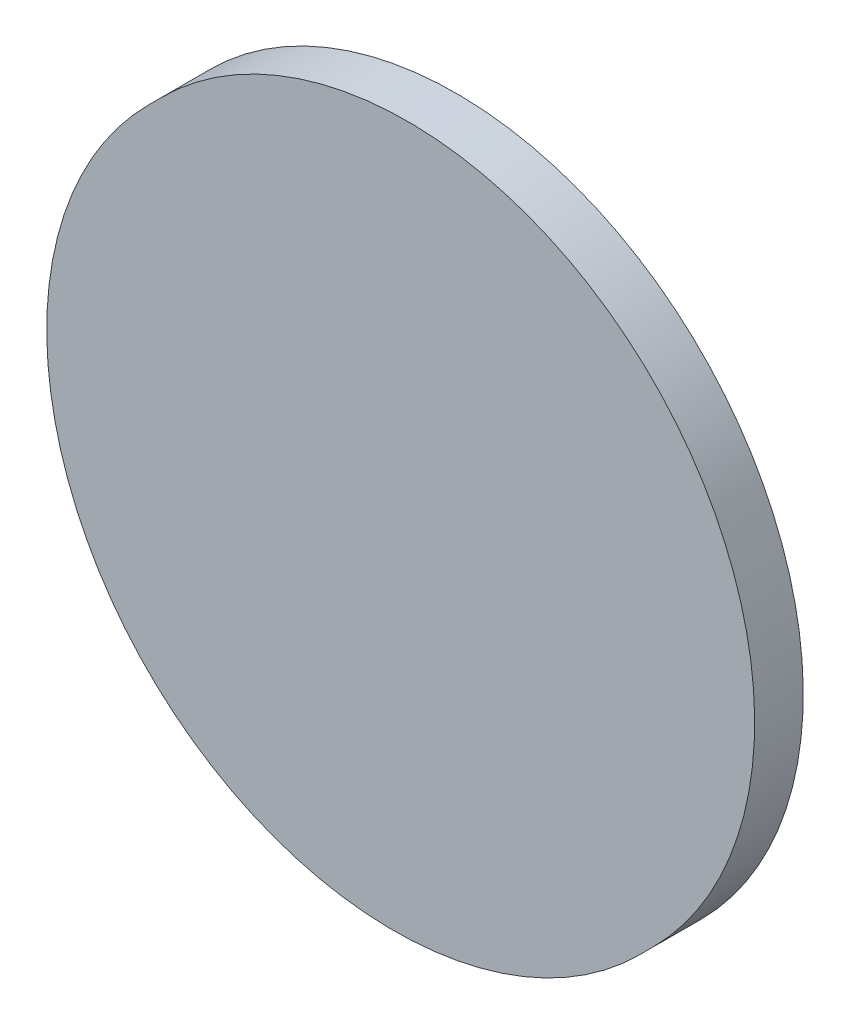
ISO-10303-21;
HEADER;
FILE_DESCRIPTION(('STEP AP214'),'2;1');
FILE_NAME('part.step','',(''),(''),'','','');
FILE_SCHEMA(('AUTOMOTIVE_DESIGN { 1 0 10303 214 1 1 1 1 }'));
ENDSEC;
DATA;
#1=APPLICATION_CONTEXT('core data for automotive mechanical design processes');
#2=APPLICATION_PROTOCOL_DEFINITION('international standard','automotive_design',2000,#1);
#3=PRODUCT_CONTEXT('',#1,'mechanical');
#4=PRODUCT('Part','Part','',(#3));
#5=PRODUCT_RELATED_PRODUCT_CATEGORY('part','',(#4));
#6=PRODUCT_DEFINITION_FORMATION('','',#4);
#7=PRODUCT_DEFINITION_CONTEXT('part definition',#1,'design');
#8=PRODUCT_DEFINITION('design','',#6,#7);
#9=PRODUCT_DEFINITION_SHAPE('','',#8);
#10=(LENGTH_UNIT() NAMED_UNIT(*) SI_UNIT(.MILLI.,.METRE.));
#11=(NAMED_UNIT(*) PLANE_ANGLE_UNIT() SI_UNIT($,.RADIAN.));
#12=(NAMED_UNIT(*) SI_UNIT($,.STERADIAN.) SOLID_ANGLE_UNIT());
#13=UNCERTAINTY_MEASURE_WITH_UNIT(LENGTH_MEASURE(1.E-05),#10,'distance_accuracy_value','');
#14=(GEOMETRIC_REPRESENTATION_CONTEXT(3) GLOBAL_UNCERTAINTY_ASSIGNED_CONTEXT((#13)) GLOBAL_UNIT_ASSIGNED_CONTEXT((#10,
#11,#12)) REPRESENTATION_CONTEXT('',''));
#15=CARTESIAN_POINT('',(0.,0.,0.));
#16=DIRECTION('',(0.,0.,1.));
#17=DIRECTION('',(1.,0.,0.));
#18=AXIS2_PLACEMENT_3D('',#15,#16,#17);
#19=CARTESIAN_POINT('',(155.326776,-110.554776,1.635));
#20=DIRECTION('',(0.,0.,1.));
#21=DIRECTION('',(1.,0.,0.));
#22=AXIS2_PLACEMENT_3D('',#19,#20,#21);
#23=PLANE('',#22);
#24=DIRECTION('',(0.707106781186048,0.707106781187048,0.));
#25=VECTOR('',#24,1.);
#26=CARTESIAN_POINT('',(155.326776,-110.554776,1.635));
#27=LINE('',#26,#25);
#28=CARTESIAN_POINT('',(155.326776,-110.554776,1.635));
#29=VERTEX_POINT('',#28);
#30=CARTESIAN_POINT('',(155.336776,-110.544776,1.635));
#31=VERTEX_POINT('',#30);
#32=EDGE_CURVE('E96',#29,#31,#27,.T.);
#33=ORIENTED_EDGE('',*,*,#32,.T.);
#34=CARTESIAN_POINT('',(155.1599995,-110.3679995,1.635));
#35=DIRECTION('',(0.,0.,1.));
#36=DIRECTION('',(0.707106781186548,-0.707106781186548,0.));
#37=AXIS2_PLACEMENT_3D('',#34,#35,#36);
#38=CIRCLE('',#37,0.249999723809);
#39=CARTESIAN_POINT('',(154.983223,-110.191223,1.635));
#40=VERTEX_POINT('',#39);
#41=EDGE_CURVE('E75',#31,#40,#38,.T.);
#42=ORIENTED_EDGE('',*,*,#41,.T.);
#43=DIRECTION('',(-0.707106781187048,-0.707106781186048,0.));
#44=VECTOR('',#43,1.);
#45=CARTESIAN_POINT('',(154.983223,-110.191223,1.635));
#46=LINE('',#45,#44);
#47=CARTESIAN_POINT('',(154.973223,-110.201223,1.635));
#48=VERTEX_POINT('',#47);
#49=EDGE_CURVE('E80',#40,#48,#46,.T.);
#50=ORIENTED_EDGE('',*,*,#49,.T.);
#51=CARTESIAN_POINT('',(155.1499995,-110.3779995,1.635));
#52=DIRECTION('',(0.,0.,1.));
#53=DIRECTION('',(-0.707106781186548,0.707106781186548,0.));
#54=AXIS2_PLACEMENT_3D('',#51,#52,#53);
#55=CIRCLE('',#54,0.249999723809);
#56=EDGE_CURVE('E11',#48,#29,#55,.T.);
#57=ORIENTED_EDGE('',*,*,#56,.T.);
#58=EDGE_LOOP('',(#33,#42,#50,#57));
#59=FACE_BOUND('',#58,.T.);
#60=ADVANCED_FACE('F17',(#59),#23,.T.);
#61=CARTESIAN_POINT('',(155.326776,-110.554776,1.6));
#62=DIRECTION('',(0.,0.,1.));
#63=DIRECTION('',(1.,0.,0.));
#64=AXIS2_PLACEMENT_3D('',#61,#62,#63);
#65=PLANE('',#64);
#66=CARTESIAN_POINT('',(155.1499995,-110.3779995,1.6));
#67=DIRECTION('',(0.,0.,1.));
#68=DIRECTION('',(-0.707106781186548,0.707106781186548,0.));
#69=AXIS2_PLACEMENT_3D('',#66,#67,#68);
#70=CIRCLE('',#69,0.249999723809);
#71=CARTESIAN_POINT('',(154.973223,-110.201223,1.6));
#72=VERTEX_POINT('',#71);
#73=CARTESIAN_POINT('',(155.326776,-110.554776,1.6));
#74=VERTEX_POINT('',#73);
#75=EDGE_CURVE('E27',#72,#74,#70,.T.);
#76=ORIENTED_EDGE('',*,*,#75,.F.);
#77=DIRECTION('',(-0.707106781187048,-0.707106781186048,0.));
#78=VECTOR('',#77,1.);
#79=CARTESIAN_POINT('',(154.983223,-110.191223,1.6));
#80=LINE('',#79,#78);
#81=CARTESIAN_POINT('',(154.983223,-110.191223,1.6));
#82=VERTEX_POINT('',#81);
#83=EDGE_CURVE('E65',#82,#72,#80,.T.);
#84=ORIENTED_EDGE('',*,*,#83,.F.);
#85=CARTESIAN_POINT('',(155.1599995,-110.3679995,1.6));
#86=DIRECTION('',(0.,0.,1.));
#87=DIRECTION('',(0.707106781186548,-0.707106781186548,0.));
#88=AXIS2_PLACEMENT_3D('',#85,#86,#87);
#89=CIRCLE('',#88,0.249999723809);
#90=CARTESIAN_POINT('',(155.336776,-110.544776,1.6));
#91=VERTEX_POINT('',#90);
#92=EDGE_CURVE('E69',#91,#82,#89,.T.);
#93=ORIENTED_EDGE('',*,*,#92,.F.);
#94=DIRECTION('',(0.707106781186048,0.707106781187048,0.));
#95=VECTOR('',#94,1.);
#96=CARTESIAN_POINT('',(155.326776,-110.554776,1.6));
#97=LINE('',#96,#95);
#98=EDGE_CURVE('E113',#74,#91,#97,.T.);
#99=ORIENTED_EDGE('',*,*,#98,.F.);
#100=EDGE_LOOP('',(#76,#84,#93,#99));
#101=FACE_BOUND('',#100,.T.);
#102=ADVANCED_FACE('F19',(#101),#65,.F.);
#103=CARTESIAN_POINT('',(155.1499995,-110.3779995,1.6));
#104=DIRECTION('',(0.,0.,-1.));
#105=DIRECTION('',(-0.707106781186548,0.707106781186548,0.));
#106=AXIS2_PLACEMENT_3D('',#103,#104,#105);
#107=CYLINDRICAL_SURFACE('',#106,0.249999723809);
#108=ORIENTED_EDGE('',*,*,#75,.T.);
#109=DIRECTION('',(0.,0.,1.));
#110=VECTOR('',#109,1.);
#111=CARTESIAN_POINT('',(155.326776,-110.554776,1.6));
#112=LINE('',#111,#110);
#113=EDGE_CURVE('E90',#74,#29,#112,.T.);
#114=ORIENTED_EDGE('',*,*,#113,.T.);
#115=ORIENTED_EDGE('',*,*,#56,.F.);
#116=DIRECTION('',(0.,0.,1.));
#117=VECTOR('',#116,1.);
#118=CARTESIAN_POINT('',(154.973223,-110.201223,1.6));
#119=LINE('',#118,#117);
#120=EDGE_CURVE('E74',#72,#48,#119,.T.);
#121=ORIENTED_EDGE('',*,*,#120,.F.);
#122=EDGE_LOOP('',(#108,#114,#115,#121));
#123=FACE_BOUND('',#122,.T.);
#124=ADVANCED_FACE('F182',(#123),#107,.T.);
#125=CARTESIAN_POINT('',(154.983223,-110.191223,1.6));
#126=DIRECTION('',(0.707106781186048,-0.707106781187048,0.));
#127=DIRECTION('',(0.,0.,-1.));
#128=AXIS2_PLACEMENT_3D('',#125,#126,#127);
#129=PLANE('',#128);
#130=ORIENTED_EDGE('',*,*,#83,.T.);
#131=ORIENTED_EDGE('',*,*,#120,.T.);
#132=ORIENTED_EDGE('',*,*,#49,.F.);
#133=DIRECTION('',(0.,0.,1.));
#134=VECTOR('',#133,1.);
#135=CARTESIAN_POINT('',(154.983223,-110.191223,1.6));
#136=LINE('',#135,#134);
#137=EDGE_CURVE('E78',#82,#40,#136,.T.);
#138=ORIENTED_EDGE('',*,*,#137,.F.);
#139=EDGE_LOOP('',(#130,#131,#132,#138));
#140=FACE_BOUND('',#139,.T.);
#141=ADVANCED_FACE('F79',(#140),#129,.F.);
#142=CARTESIAN_POINT('',(155.1599995,-110.3679995,1.6));
#143=DIRECTION('',(0.,0.,-1.));
#144=DIRECTION('',(0.707106781186548,-0.707106781186548,0.));
#145=AXIS2_PLACEMENT_3D('',#142,#143,#144);
#146=CYLINDRICAL_SURFACE('',#145,0.249999723809);
#147=ORIENTED_EDGE('',*,*,#92,.T.);
#148=ORIENTED_EDGE('',*,*,#137,.T.);
#149=ORIENTED_EDGE('',*,*,#41,.F.);
#150=DIRECTION('',(0.,0.,1.));
#151=VECTOR('',#150,1.);
#152=CARTESIAN_POINT('',(155.336776,-110.544776,1.6));
#153=LINE('',#152,#151);
#154=EDGE_CURVE('E87',#91,#31,#153,.T.);
#155=ORIENTED_EDGE('',*,*,#154,.F.);
#156=EDGE_LOOP('',(#147,#148,#149,#155));
#157=FACE_BOUND('',#156,.T.);
#158=ADVANCED_FACE('F85',(#157),#146,.T.);
#159=CARTESIAN_POINT('',(155.326776,-110.554776,1.6));
#160=DIRECTION('',(-0.707106781187048,0.707106781186048,0.));
#161=DIRECTION('',(0.,0.,1.));
#162=AXIS2_PLACEMENT_3D('',#159,#160,#161);
#163=PLANE('',#162);
#164=ORIENTED_EDGE('',*,*,#98,.T.);
#165=ORIENTED_EDGE('',*,*,#154,.T.);
#166=ORIENTED_EDGE('',*,*,#32,.F.);
#167=ORIENTED_EDGE('',*,*,#113,.F.);
#168=EDGE_LOOP('',(#164,#165,#166,#167));
#169=FACE_BOUND('',#168,.T.);
#170=ADVANCED_FACE('F122',(#169),#163,.F.);
#171=CLOSED_SHELL('',(#60,#102,#124,#141,#158,#170));
#172=MANIFOLD_SOLID_BREP('B1',#171);
#173=ADVANCED_BREP_SHAPE_REPRESENTATION('',(#18,#172),#14);
#174=SHAPE_DEFINITION_REPRESENTATION(#9,#173);
ENDSEC;
END-ISO-10303-21;
